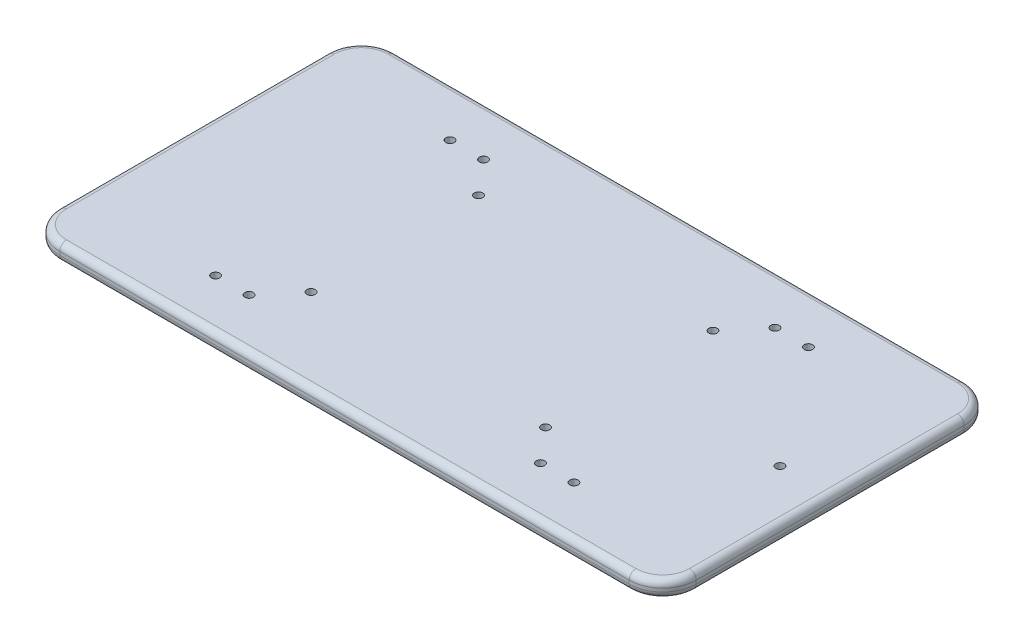
ISO-10303-21;
HEADER;
FILE_DESCRIPTION(('STEP AP214'),'2;1');
FILE_NAME('part.step','',(''),(''),'','','');
FILE_SCHEMA(('AUTOMOTIVE_DESIGN { 1 0 10303 214 1 1 1 1 }'));
ENDSEC;
DATA;
#1=APPLICATION_CONTEXT('core data for automotive mechanical design processes');
#2=APPLICATION_PROTOCOL_DEFINITION('international standard','automotive_design',2000,#1);
#3=PRODUCT_CONTEXT('',#1,'mechanical');
#4=PRODUCT('Part','Part','',(#3));
#5=PRODUCT_RELATED_PRODUCT_CATEGORY('part','',(#4));
#6=PRODUCT_DEFINITION_FORMATION('','',#4);
#7=PRODUCT_DEFINITION_CONTEXT('part definition',#1,'design');
#8=PRODUCT_DEFINITION('design','',#6,#7);
#9=PRODUCT_DEFINITION_SHAPE('','',#8);
#10=(LENGTH_UNIT() NAMED_UNIT(*) SI_UNIT(.MILLI.,.METRE.));
#11=(NAMED_UNIT(*) PLANE_ANGLE_UNIT() SI_UNIT($,.RADIAN.));
#12=(NAMED_UNIT(*) SI_UNIT($,.STERADIAN.) SOLID_ANGLE_UNIT());
#13=UNCERTAINTY_MEASURE_WITH_UNIT(LENGTH_MEASURE(1.E-05),#10,'distance_accuracy_value','');
#14=(GEOMETRIC_REPRESENTATION_CONTEXT(3) GLOBAL_UNCERTAINTY_ASSIGNED_CONTEXT((#13)) GLOBAL_UNIT_ASSIGNED_CONTEXT((#10,
#11,#12)) REPRESENTATION_CONTEXT('',''));
#15=CARTESIAN_POINT('',(0.,0.,0.));
#16=DIRECTION('',(0.,0.,1.));
#17=DIRECTION('',(1.,0.,0.));
#18=AXIS2_PLACEMENT_3D('',#15,#16,#17);
#19=CARTESIAN_POINT('',(0.35780175355887,47.5,0.));
#20=DIRECTION('',(0.,-1.,0.));
#21=DIRECTION('',(0.,0.,-1.));
#22=AXIS2_PLACEMENT_3D('',#19,#20,#21);
#23=PLANE('',#22);
#24=DIRECTION('',(0.,0.,1.));
#25=VECTOR('',#24,1.);
#26=CARTESIAN_POINT('',(-1673.64219824644,47.5,0.));
#27=LINE('',#26,#25);
#28=CARTESIAN_POINT('',(-1673.64219824644,47.5,-720.));
#29=VERTEX_POINT('',#28);
#30=CARTESIAN_POINT('',(-1673.64219824644,47.5,720.));
#31=VERTEX_POINT('',#30);
#32=EDGE_CURVE('E60',#29,#31,#27,.T.);
#33=ORIENTED_EDGE('',*,*,#32,.T.);
#34=CARTESIAN_POINT('',(-1529.64219824644,47.5,720.));
#35=DIRECTION('',(0.,-1.,0.));
#36=DIRECTION('',(0.,0.,-1.));
#37=AXIS2_PLACEMENT_3D('',#34,#35,#36);
#38=CIRCLE('',#37,144.);
#39=CARTESIAN_POINT('',(-1529.64219824644,47.5,864.));
#40=VERTEX_POINT('',#39);
#41=EDGE_CURVE('E273',#31,#40,#38,.F.);
#42=ORIENTED_EDGE('',*,*,#41,.T.);
#43=DIRECTION('',(1.,0.,0.));
#44=VECTOR('',#43,1.);
#45=CARTESIAN_POINT('',(0.35780175355887,47.5,864.));
#46=LINE('',#45,#44);
#47=CARTESIAN_POINT('',(1530.35780175356,47.5,864.));
#48=VERTEX_POINT('',#47);
#49=EDGE_CURVE('E254',#40,#48,#46,.T.);
#50=ORIENTED_EDGE('',*,*,#49,.T.);
#51=CARTESIAN_POINT('',(1530.35780175356,47.5,720.));
#52=DIRECTION('',(0.,-1.,0.));
#53=DIRECTION('',(0.,0.,-1.));
#54=AXIS2_PLACEMENT_3D('',#51,#52,#53);
#55=CIRCLE('',#54,144.);
#56=CARTESIAN_POINT('',(1674.35780175356,47.5,720.));
#57=VERTEX_POINT('',#56);
#58=EDGE_CURVE('E257',#48,#57,#55,.F.);
#59=ORIENTED_EDGE('',*,*,#58,.T.);
#60=DIRECTION('',(0.,0.,-1.));
#61=VECTOR('',#60,1.);
#62=CARTESIAN_POINT('',(1674.35780175356,47.5,0.));
#63=LINE('',#62,#61);
#64=CARTESIAN_POINT('',(1674.35780175356,47.5,-720.));
#65=VERTEX_POINT('',#64);
#66=EDGE_CURVE('E260',#57,#65,#63,.T.);
#67=ORIENTED_EDGE('',*,*,#66,.T.);
#68=CARTESIAN_POINT('',(1530.35780175356,47.5,-720.));
#69=DIRECTION('',(0.,-1.,0.));
#70=DIRECTION('',(0.,0.,-1.));
#71=AXIS2_PLACEMENT_3D('',#68,#69,#70);
#72=CIRCLE('',#71,144.);
#73=CARTESIAN_POINT('',(1530.35780175356,47.5,-864.));
#74=VERTEX_POINT('',#73);
#75=EDGE_CURVE('E263',#65,#74,#72,.F.);
#76=ORIENTED_EDGE('',*,*,#75,.T.);
#77=DIRECTION('',(-1.,0.,0.));
#78=VECTOR('',#77,1.);
#79=CARTESIAN_POINT('',(0.35780175355887,47.5,-864.));
#80=LINE('',#79,#78);
#81=CARTESIAN_POINT('',(-1529.64219824644,47.5,-864.));
#82=VERTEX_POINT('',#81);
#83=EDGE_CURVE('E266',#74,#82,#80,.T.);
#84=ORIENTED_EDGE('',*,*,#83,.T.);
#85=CARTESIAN_POINT('',(-1529.64219824644,47.5,-720.));
#86=DIRECTION('',(0.,-1.,0.));
#87=DIRECTION('',(0.,0.,-1.));
#88=AXIS2_PLACEMENT_3D('',#85,#86,#87);
#89=CIRCLE('',#88,144.);
#90=EDGE_CURVE('E65',#82,#29,#89,.F.);
#91=ORIENTED_EDGE('',*,*,#90,.T.);
#92=EDGE_LOOP('',(#33,#42,#50,#59,#67,#76,#84,#91));
#93=FACE_BOUND('',#92,.T.);
#94=CARTESIAN_POINT('',(-629.642198246441,47.5,-450.));
#95=DIRECTION('',(0.,1.,0.));
#96=DIRECTION('',(0.,0.,1.));
#97=AXIS2_PLACEMENT_3D('',#94,#95,#96);
#98=CIRCLE('',#97,22.5);
#99=CARTESIAN_POINT('',(-629.642198246441,47.5,-427.5));
#100=VERTEX_POINT('',#99);
#101=EDGE_CURVE('E356',#100,#100,#98,.T.);
#102=ORIENTED_EDGE('',*,*,#101,.F.);
#103=EDGE_LOOP('',(#102));
#104=FACE_BOUND('',#103,.T.);
#105=CARTESIAN_POINT('',(630.357801753559,47.5,-450.));
#106=DIRECTION('',(0.,1.,0.));
#107=DIRECTION('',(0.,0.,1.));
#108=AXIS2_PLACEMENT_3D('',#105,#106,#107);
#109=CIRCLE('',#108,22.5);
#110=CARTESIAN_POINT('',(630.357801753559,47.5,-427.5));
#111=VERTEX_POINT('',#110);
#112=EDGE_CURVE('E855',#111,#111,#109,.T.);
#113=ORIENTED_EDGE('',*,*,#112,.F.);
#114=EDGE_LOOP('',(#113));
#115=FACE_BOUND('',#114,.T.);
#116=CARTESIAN_POINT('',(630.357801753559,47.5,450.));
#117=DIRECTION('',(0.,1.,0.));
#118=DIRECTION('',(0.,0.,1.));
#119=AXIS2_PLACEMENT_3D('',#116,#117,#118);
#120=CIRCLE('',#119,22.5);
#121=CARTESIAN_POINT('',(630.357801753559,47.5,472.5));
#122=VERTEX_POINT('',#121);
#123=EDGE_CURVE('E863',#122,#122,#120,.T.);
#124=ORIENTED_EDGE('',*,*,#123,.F.);
#125=EDGE_LOOP('',(#124));
#126=FACE_BOUND('',#125,.T.);
#127=CARTESIAN_POINT('',(-629.642198246441,47.5,450.));
#128=DIRECTION('',(0.,1.,0.));
#129=DIRECTION('',(0.,0.,1.));
#130=AXIS2_PLACEMENT_3D('',#127,#128,#129);
#131=CIRCLE('',#130,22.5);
#132=CARTESIAN_POINT('',(-629.642198246441,47.5,472.5));
#133=VERTEX_POINT('',#132);
#134=EDGE_CURVE('E870',#133,#133,#131,.T.);
#135=ORIENTED_EDGE('',*,*,#134,.F.);
#136=EDGE_LOOP('',(#135));
#137=FACE_BOUND('',#136,.T.);
#138=CARTESIAN_POINT('',(1440.35780175356,47.5,1.22488336844059E-13));
#139=DIRECTION('',(0.,1.,0.));
#140=DIRECTION('',(0.,0.,1.));
#141=AXIS2_PLACEMENT_3D('',#138,#139,#140);
#142=CIRCLE('',#141,22.5);
#143=CARTESIAN_POINT('',(1440.35780175356,47.5,22.5000000000001));
#144=VERTEX_POINT('',#143);
#145=EDGE_CURVE('E878',#144,#144,#142,.T.);
#146=ORIENTED_EDGE('',*,*,#145,.F.);
#147=EDGE_LOOP('',(#146));
#148=FACE_BOUND('',#147,.T.);
#149=CARTESIAN_POINT('',(-962.642198246441,47.5,630.));
#150=DIRECTION('',(0.,1.,0.));
#151=DIRECTION('',(0.,0.,1.));
#152=AXIS2_PLACEMENT_3D('',#149,#150,#151);
#153=CIRCLE('',#152,22.5);
#154=CARTESIAN_POINT('',(-962.642198246441,47.5,652.5));
#155=VERTEX_POINT('',#154);
#156=EDGE_CURVE('E886',#155,#155,#153,.T.);
#157=ORIENTED_EDGE('',*,*,#156,.F.);
#158=EDGE_LOOP('',(#157));
#159=FACE_BOUND('',#158,.T.);
#160=CARTESIAN_POINT('',(-782.642198246441,47.5,630.));
#161=DIRECTION('',(0.,1.,0.));
#162=DIRECTION('',(0.,0.,1.));
#163=AXIS2_PLACEMENT_3D('',#160,#161,#162);
#164=CIRCLE('',#163,22.5000000000001);
#165=CARTESIAN_POINT('',(-782.642198246441,47.5,652.5));
#166=VERTEX_POINT('',#165);
#167=EDGE_CURVE('E894',#166,#166,#164,.T.);
#168=ORIENTED_EDGE('',*,*,#167,.F.);
#169=EDGE_LOOP('',(#168));
#170=FACE_BOUND('',#169,.T.);
#171=CARTESIAN_POINT('',(-782.642198246441,47.5,-630.));
#172=DIRECTION('',(0.,1.,0.));
#173=DIRECTION('',(0.,0.,-1.));
#174=AXIS2_PLACEMENT_3D('',#171,#172,#173);
#175=CIRCLE('',#174,22.5000000000001);
#176=CARTESIAN_POINT('',(-782.642198246441,47.5,-652.5));
#177=VERTEX_POINT('',#176);
#178=EDGE_CURVE('E902',#177,#177,#175,.T.);
#179=ORIENTED_EDGE('',*,*,#178,.F.);
#180=EDGE_LOOP('',(#179));
#181=FACE_BOUND('',#180,.T.);
#182=CARTESIAN_POINT('',(-962.642198246441,47.5,-630.));
#183=DIRECTION('',(0.,1.,0.));
#184=DIRECTION('',(0.,0.,-1.));
#185=AXIS2_PLACEMENT_3D('',#182,#183,#184);
#186=CIRCLE('',#185,22.5);
#187=CARTESIAN_POINT('',(-962.642198246441,47.5,-652.5));
#188=VERTEX_POINT('',#187);
#189=EDGE_CURVE('E910',#188,#188,#186,.T.);
#190=ORIENTED_EDGE('',*,*,#189,.F.);
#191=EDGE_LOOP('',(#190));
#192=FACE_BOUND('',#191,.T.);
#193=CARTESIAN_POINT('',(783.357801753558,47.5,-630.));
#194=DIRECTION('',(0.,1.,0.));
#195=DIRECTION('',(0.,0.,1.));
#196=AXIS2_PLACEMENT_3D('',#193,#194,#195);
#197=CIRCLE('',#196,22.5000000000001);
#198=CARTESIAN_POINT('',(783.357801753558,47.5,-607.5));
#199=VERTEX_POINT('',#198);
#200=EDGE_CURVE('E918',#199,#199,#197,.T.);
#201=ORIENTED_EDGE('',*,*,#200,.F.);
#202=EDGE_LOOP('',(#201));
#203=FACE_BOUND('',#202,.T.);
#204=CARTESIAN_POINT('',(963.357801753558,47.5,-630.));
#205=DIRECTION('',(0.,1.,0.));
#206=DIRECTION('',(0.,0.,1.));
#207=AXIS2_PLACEMENT_3D('',#204,#205,#206);
#208=CIRCLE('',#207,22.5);
#209=CARTESIAN_POINT('',(963.357801753558,47.5,-607.5));
#210=VERTEX_POINT('',#209);
#211=EDGE_CURVE('E926',#210,#210,#208,.T.);
#212=ORIENTED_EDGE('',*,*,#211,.F.);
#213=EDGE_LOOP('',(#212));
#214=FACE_BOUND('',#213,.T.);
#215=CARTESIAN_POINT('',(963.357801753558,47.5,630.));
#216=DIRECTION('',(0.,1.,0.));
#217=DIRECTION('',(0.,0.,-1.));
#218=AXIS2_PLACEMENT_3D('',#215,#216,#217);
#219=CIRCLE('',#218,22.5);
#220=CARTESIAN_POINT('',(963.357801753558,47.5,607.5));
#221=VERTEX_POINT('',#220);
#222=EDGE_CURVE('E934',#221,#221,#219,.T.);
#223=ORIENTED_EDGE('',*,*,#222,.F.);
#224=EDGE_LOOP('',(#223));
#225=FACE_BOUND('',#224,.T.);
#226=CARTESIAN_POINT('',(783.357801753558,47.5,630.));
#227=DIRECTION('',(0.,1.,0.));
#228=DIRECTION('',(0.,0.,-1.));
#229=AXIS2_PLACEMENT_3D('',#226,#227,#228);
#230=CIRCLE('',#229,22.5000000000001);
#231=CARTESIAN_POINT('',(783.357801753558,47.5,607.5));
#232=VERTEX_POINT('',#231);
#233=EDGE_CURVE('E942',#232,#232,#230,.T.);
#234=ORIENTED_EDGE('',*,*,#233,.F.);
#235=EDGE_LOOP('',(#234));
#236=FACE_BOUND('',#235,.T.);
#237=ADVANCED_FACE('F42',(#93,#104,#115,#126,#137,#148,#159,#170,#181,#192,#203,#214,#225,#236),
#23,.F.);
#238=CARTESIAN_POINT('',(0.35780175355887,-42.5,0.));
#239=DIRECTION('',(0.,-1.,0.));
#240=DIRECTION('',(0.,0.,-1.));
#241=AXIS2_PLACEMENT_3D('',#238,#239,#240);
#242=PLANE('',#241);
#243=DIRECTION('',(1.,0.,0.));
#244=VECTOR('',#243,1.);
#245=CARTESIAN_POINT('',(-1529.64219824644,-42.5,864.));
#246=LINE('',#245,#244);
#247=CARTESIAN_POINT('',(1530.35780175356,-42.5,864.));
#248=VERTEX_POINT('',#247);
#249=CARTESIAN_POINT('',(-1529.64219824644,-42.5,864.));
#250=VERTEX_POINT('',#249);
#251=EDGE_CURVE('E162',#248,#250,#246,.F.);
#252=ORIENTED_EDGE('',*,*,#251,.T.);
#253=CARTESIAN_POINT('',(-1529.64219824644,-42.5,720.));
#254=DIRECTION('',(0.,-1.,0.));
#255=DIRECTION('',(0.,0.,-1.));
#256=AXIS2_PLACEMENT_3D('',#253,#254,#255);
#257=CIRCLE('',#256,144.);
#258=CARTESIAN_POINT('',(-1673.64219824644,-42.5,720.));
#259=VERTEX_POINT('',#258);
#260=EDGE_CURVE('E208',#250,#259,#257,.T.);
#261=ORIENTED_EDGE('',*,*,#260,.T.);
#262=DIRECTION('',(0.,0.,1.));
#263=VECTOR('',#262,1.);
#264=CARTESIAN_POINT('',(-1673.64219824644,-42.5,-720.));
#265=LINE('',#264,#263);
#266=CARTESIAN_POINT('',(-1673.64219824644,-42.5,-720.));
#267=VERTEX_POINT('',#266);
#268=EDGE_CURVE('E205',#259,#267,#265,.F.);
#269=ORIENTED_EDGE('',*,*,#268,.T.);
#270=CARTESIAN_POINT('',(-1529.64219824644,-42.5,-720.));
#271=DIRECTION('',(0.,-1.,0.));
#272=DIRECTION('',(0.,0.,-1.));
#273=AXIS2_PLACEMENT_3D('',#270,#271,#272);
#274=CIRCLE('',#273,144.);
#275=CARTESIAN_POINT('',(-1529.64219824644,-42.5,-864.));
#276=VERTEX_POINT('',#275);
#277=EDGE_CURVE('E202',#267,#276,#274,.T.);
#278=ORIENTED_EDGE('',*,*,#277,.T.);
#279=DIRECTION('',(-1.,0.,0.));
#280=VECTOR('',#279,1.);
#281=CARTESIAN_POINT('',(1530.35780175356,-42.5,-864.));
#282=LINE('',#281,#280);
#283=CARTESIAN_POINT('',(1530.35780175356,-42.5,-864.));
#284=VERTEX_POINT('',#283);
#285=EDGE_CURVE('E199',#276,#284,#282,.F.);
#286=ORIENTED_EDGE('',*,*,#285,.T.);
#287=CARTESIAN_POINT('',(1530.35780175356,-42.5,-720.));
#288=DIRECTION('',(0.,-1.,0.));
#289=DIRECTION('',(0.,0.,-1.));
#290=AXIS2_PLACEMENT_3D('',#287,#288,#289);
#291=CIRCLE('',#290,144.);
#292=CARTESIAN_POINT('',(1674.35780175356,-42.5,-720.));
#293=VERTEX_POINT('',#292);
#294=EDGE_CURVE('E196',#284,#293,#291,.T.);
#295=ORIENTED_EDGE('',*,*,#294,.T.);
#296=DIRECTION('',(0.,0.,-1.));
#297=VECTOR('',#296,1.);
#298=CARTESIAN_POINT('',(1674.35780175356,-42.5,720.));
#299=LINE('',#298,#297);
#300=CARTESIAN_POINT('',(1674.35780175356,-42.5,720.));
#301=VERTEX_POINT('',#300);
#302=EDGE_CURVE('E165',#293,#301,#299,.F.);
#303=ORIENTED_EDGE('',*,*,#302,.T.);
#304=CARTESIAN_POINT('',(1530.35780175356,-42.5,720.));
#305=DIRECTION('',(0.,-1.,0.));
#306=DIRECTION('',(0.,0.,-1.));
#307=AXIS2_PLACEMENT_3D('',#304,#305,#306);
#308=CIRCLE('',#307,144.);
#309=EDGE_CURVE('E156',#301,#248,#308,.T.);
#310=ORIENTED_EDGE('',*,*,#309,.T.);
#311=EDGE_LOOP('',(#252,#261,#269,#278,#286,#295,#303,#310));
#312=FACE_BOUND('',#311,.T.);
#313=CARTESIAN_POINT('',(963.357801753558,-42.5,630.));
#314=DIRECTION('',(0.,1.,0.));
#315=DIRECTION('',(0.,0.,-1.));
#316=AXIS2_PLACEMENT_3D('',#313,#314,#315);
#317=CIRCLE('',#316,22.5);
#318=CARTESIAN_POINT('',(963.357801753558,-42.5,607.5));
#319=VERTEX_POINT('',#318);
#320=EDGE_CURVE('E938',#319,#319,#317,.T.);
#321=ORIENTED_EDGE('',*,*,#320,.T.);
#322=EDGE_LOOP('',(#321));
#323=FACE_BOUND('',#322,.T.);
#324=CARTESIAN_POINT('',(783.357801753558,-42.5,-630.));
#325=DIRECTION('',(0.,1.,0.));
#326=DIRECTION('',(0.,0.,1.));
#327=AXIS2_PLACEMENT_3D('',#324,#325,#326);
#328=CIRCLE('',#327,22.5000000000001);
#329=CARTESIAN_POINT('',(783.357801753558,-42.5,-607.5));
#330=VERTEX_POINT('',#329);
#331=EDGE_CURVE('E922',#330,#330,#328,.T.);
#332=ORIENTED_EDGE('',*,*,#331,.T.);
#333=EDGE_LOOP('',(#332));
#334=FACE_BOUND('',#333,.T.);
#335=CARTESIAN_POINT('',(-782.642198246441,-42.5,-630.));
#336=DIRECTION('',(0.,1.,0.));
#337=DIRECTION('',(0.,0.,-1.));
#338=AXIS2_PLACEMENT_3D('',#335,#336,#337);
#339=CIRCLE('',#338,22.5000000000001);
#340=CARTESIAN_POINT('',(-782.642198246441,-42.5,-652.5));
#341=VERTEX_POINT('',#340);
#342=EDGE_CURVE('E906',#341,#341,#339,.T.);
#343=ORIENTED_EDGE('',*,*,#342,.T.);
#344=EDGE_LOOP('',(#343));
#345=FACE_BOUND('',#344,.T.);
#346=CARTESIAN_POINT('',(-962.642198246441,-42.5,630.));
#347=DIRECTION('',(0.,1.,0.));
#348=DIRECTION('',(0.,0.,1.));
#349=AXIS2_PLACEMENT_3D('',#346,#347,#348);
#350=CIRCLE('',#349,22.5);
#351=CARTESIAN_POINT('',(-962.642198246441,-42.5,652.5));
#352=VERTEX_POINT('',#351);
#353=EDGE_CURVE('E890',#352,#352,#350,.T.);
#354=ORIENTED_EDGE('',*,*,#353,.T.);
#355=EDGE_LOOP('',(#354));
#356=FACE_BOUND('',#355,.T.);
#357=CARTESIAN_POINT('',(-629.642198246441,-42.5,450.));
#358=DIRECTION('',(0.,1.,0.));
#359=DIRECTION('',(0.,0.,1.));
#360=AXIS2_PLACEMENT_3D('',#357,#358,#359);
#361=CIRCLE('',#360,22.5);
#362=CARTESIAN_POINT('',(-629.642198246441,-42.5,472.5));
#363=VERTEX_POINT('',#362);
#364=EDGE_CURVE('E874',#363,#363,#361,.T.);
#365=ORIENTED_EDGE('',*,*,#364,.T.);
#366=EDGE_LOOP('',(#365));
#367=FACE_BOUND('',#366,.T.);
#368=CARTESIAN_POINT('',(630.357801753559,-42.5,-450.));
#369=DIRECTION('',(0.,1.,0.));
#370=DIRECTION('',(0.,0.,1.));
#371=AXIS2_PLACEMENT_3D('',#368,#369,#370);
#372=CIRCLE('',#371,22.5);
#373=CARTESIAN_POINT('',(630.357801753559,-42.5,-427.5));
#374=VERTEX_POINT('',#373);
#375=EDGE_CURVE('E858',#374,#374,#372,.T.);
#376=ORIENTED_EDGE('',*,*,#375,.T.);
#377=EDGE_LOOP('',(#376));
#378=FACE_BOUND('',#377,.T.);
#379=CARTESIAN_POINT('',(-629.642198246441,-42.5,-450.));
#380=DIRECTION('',(0.,1.,0.));
#381=DIRECTION('',(0.,0.,1.));
#382=AXIS2_PLACEMENT_3D('',#379,#380,#381);
#383=CIRCLE('',#382,22.5);
#384=CARTESIAN_POINT('',(-629.642198246441,-42.5,-427.5));
#385=VERTEX_POINT('',#384);
#386=EDGE_CURVE('E363',#385,#385,#383,.T.);
#387=ORIENTED_EDGE('',*,*,#386,.T.);
#388=EDGE_LOOP('',(#387));
#389=FACE_BOUND('',#388,.T.);
#390=CARTESIAN_POINT('',(630.357801753559,-42.5,450.));
#391=DIRECTION('',(0.,1.,0.));
#392=DIRECTION('',(0.,0.,1.));
#393=AXIS2_PLACEMENT_3D('',#390,#391,#392);
#394=CIRCLE('',#393,22.5);
#395=CARTESIAN_POINT('',(630.357801753559,-42.5,472.5));
#396=VERTEX_POINT('',#395);
#397=EDGE_CURVE('E866',#396,#396,#394,.T.);
#398=ORIENTED_EDGE('',*,*,#397,.T.);
#399=EDGE_LOOP('',(#398));
#400=FACE_BOUND('',#399,.T.);
#401=CARTESIAN_POINT('',(1440.35780175356,-42.5,1.22488336844059E-13));
#402=DIRECTION('',(0.,1.,0.));
#403=DIRECTION('',(0.,0.,1.));
#404=AXIS2_PLACEMENT_3D('',#401,#402,#403);
#405=CIRCLE('',#404,22.5);
#406=CARTESIAN_POINT('',(1440.35780175356,-42.5,22.5000000000001));
#407=VERTEX_POINT('',#406);
#408=EDGE_CURVE('E882',#407,#407,#405,.T.);
#409=ORIENTED_EDGE('',*,*,#408,.T.);
#410=EDGE_LOOP('',(#409));
#411=FACE_BOUND('',#410,.T.);
#412=CARTESIAN_POINT('',(-782.642198246441,-42.5,630.));
#413=DIRECTION('',(0.,1.,0.));
#414=DIRECTION('',(0.,0.,1.));
#415=AXIS2_PLACEMENT_3D('',#412,#413,#414);
#416=CIRCLE('',#415,22.5000000000001);
#417=CARTESIAN_POINT('',(-782.642198246441,-42.5,652.5));
#418=VERTEX_POINT('',#417);
#419=EDGE_CURVE('E898',#418,#418,#416,.T.);
#420=ORIENTED_EDGE('',*,*,#419,.T.);
#421=EDGE_LOOP('',(#420));
#422=FACE_BOUND('',#421,.T.);
#423=CARTESIAN_POINT('',(-962.642198246441,-42.5,-630.));
#424=DIRECTION('',(0.,1.,0.));
#425=DIRECTION('',(0.,0.,-1.));
#426=AXIS2_PLACEMENT_3D('',#423,#424,#425);
#427=CIRCLE('',#426,22.5);
#428=CARTESIAN_POINT('',(-962.642198246441,-42.5,-652.5));
#429=VERTEX_POINT('',#428);
#430=EDGE_CURVE('E914',#429,#429,#427,.T.);
#431=ORIENTED_EDGE('',*,*,#430,.T.);
#432=EDGE_LOOP('',(#431));
#433=FACE_BOUND('',#432,.T.);
#434=CARTESIAN_POINT('',(963.357801753558,-42.5,-630.));
#435=DIRECTION('',(0.,1.,0.));
#436=DIRECTION('',(0.,0.,1.));
#437=AXIS2_PLACEMENT_3D('',#434,#435,#436);
#438=CIRCLE('',#437,22.5);
#439=CARTESIAN_POINT('',(963.357801753558,-42.5,-607.5));
#440=VERTEX_POINT('',#439);
#441=EDGE_CURVE('E930',#440,#440,#438,.T.);
#442=ORIENTED_EDGE('',*,*,#441,.T.);
#443=EDGE_LOOP('',(#442));
#444=FACE_BOUND('',#443,.T.);
#445=CARTESIAN_POINT('',(783.357801753558,-42.5,630.));
#446=DIRECTION('',(0.,1.,0.));
#447=DIRECTION('',(0.,0.,-1.));
#448=AXIS2_PLACEMENT_3D('',#445,#446,#447);
#449=CIRCLE('',#448,22.5000000000001);
#450=CARTESIAN_POINT('',(783.357801753558,-42.5,607.5));
#451=VERTEX_POINT('',#450);
#452=EDGE_CURVE('E300',#451,#451,#449,.T.);
#453=ORIENTED_EDGE('',*,*,#452,.T.);
#454=EDGE_LOOP('',(#453));
#455=FACE_BOUND('',#454,.T.);
#456=ADVANCED_FACE('F158',(#312,#323,#334,#345,#356,#367,#378,#389,#400,#411,#422,#433,#444,
#455),#242,.T.);
#457=CARTESIAN_POINT('',(1710.35780175356,47.5,900.));
#458=DIRECTION('',(-1.,0.,0.));
#459=DIRECTION('',(0.,0.,1.));
#460=AXIS2_PLACEMENT_3D('',#457,#458,#459);
#461=PLANE('',#460);
#462=DIRECTION('',(0.,-1.,0.));
#463=VECTOR('',#462,1.);
#464=CARTESIAN_POINT('',(1710.35780175356,47.5,720.));
#465=LINE('',#464,#463);
#466=CARTESIAN_POINT('',(1710.35780175356,11.5,720.));
#467=VERTEX_POINT('',#466);
#468=CARTESIAN_POINT('',(1710.35780175356,-6.5,720.));
#469=VERTEX_POINT('',#468);
#470=EDGE_CURVE('E355',#467,#469,#465,.T.);
#471=ORIENTED_EDGE('',*,*,#470,.T.);
#472=DIRECTION('',(0.,0.,-1.));
#473=VECTOR('',#472,1.);
#474=CARTESIAN_POINT('',(1710.35780175356,-6.5,-720.));
#475=LINE('',#474,#473);
#476=CARTESIAN_POINT('',(1710.35780175356,-6.5,-720.));
#477=VERTEX_POINT('',#476);
#478=EDGE_CURVE('E246',#469,#477,#475,.T.);
#479=ORIENTED_EDGE('',*,*,#478,.T.);
#480=DIRECTION('',(0.,-1.,0.));
#481=VECTOR('',#480,1.);
#482=CARTESIAN_POINT('',(1710.35780175356,47.5,-720.));
#483=LINE('',#482,#481);
#484=CARTESIAN_POINT('',(1710.35780175356,11.5,-720.));
#485=VERTEX_POINT('',#484);
#486=EDGE_CURVE('E345',#477,#485,#483,.F.);
#487=ORIENTED_EDGE('',*,*,#486,.T.);
#488=DIRECTION('',(0.,0.,-1.));
#489=VECTOR('',#488,1.);
#490=CARTESIAN_POINT('',(1710.35780175356,11.5,900.));
#491=LINE('',#490,#489);
#492=EDGE_CURVE('E243',#485,#467,#491,.F.);
#493=ORIENTED_EDGE('',*,*,#492,.T.);
#494=EDGE_LOOP('',(#471,#479,#487,#493));
#495=FACE_BOUND('',#494,.T.);
#496=ADVANCED_FACE('F351',(#495),#461,.F.);
#497=CARTESIAN_POINT('',(-1709.64219824644,47.5,-900.));
#498=DIRECTION('',(0.,0.,1.));
#499=DIRECTION('',(1.,0.,0.));
#500=AXIS2_PLACEMENT_3D('',#497,#498,#499);
#501=PLANE('',#500);
#502=DIRECTION('',(0.,-1.,0.));
#503=VECTOR('',#502,1.);
#504=CARTESIAN_POINT('',(1530.35780175356,47.5,-900.));
#505=LINE('',#504,#503);
#506=CARTESIAN_POINT('',(1530.35780175356,11.5,-900.));
#507=VERTEX_POINT('',#506);
#508=CARTESIAN_POINT('',(1530.35780175356,-6.5,-900.));
#509=VERTEX_POINT('',#508);
#510=EDGE_CURVE('E348',#507,#509,#505,.T.);
#511=ORIENTED_EDGE('',*,*,#510,.T.);
#512=DIRECTION('',(-1.,0.,0.));
#513=VECTOR('',#512,1.);
#514=CARTESIAN_POINT('',(-1529.64219824644,-6.5,-900.));
#515=LINE('',#514,#513);
#516=CARTESIAN_POINT('',(-1529.64219824644,-6.5,-900.));
#517=VERTEX_POINT('',#516);
#518=EDGE_CURVE('E234',#509,#517,#515,.T.);
#519=ORIENTED_EDGE('',*,*,#518,.T.);
#520=DIRECTION('',(0.,-1.,0.));
#521=VECTOR('',#520,1.);
#522=CARTESIAN_POINT('',(-1529.64219824644,47.5,-900.));
#523=LINE('',#522,#521);
#524=CARTESIAN_POINT('',(-1529.64219824644,11.5,-900.));
#525=VERTEX_POINT('',#524);
#526=EDGE_CURVE('E374',#517,#525,#523,.F.);
#527=ORIENTED_EDGE('',*,*,#526,.T.);
#528=DIRECTION('',(-1.,0.,0.));
#529=VECTOR('',#528,1.);
#530=CARTESIAN_POINT('',(-1709.64219824644,11.5,-900.));
#531=LINE('',#530,#529);
#532=EDGE_CURVE('E231',#525,#507,#531,.F.);
#533=ORIENTED_EDGE('',*,*,#532,.T.);
#534=EDGE_LOOP('',(#511,#519,#527,#533));
#535=FACE_BOUND('',#534,.T.);
#536=ADVANCED_FACE('F440',(#535),#501,.F.);
#537=CARTESIAN_POINT('',(-1709.64219824644,47.5,900.));
#538=DIRECTION('',(1.,0.,0.));
#539=DIRECTION('',(0.,0.,-1.));
#540=AXIS2_PLACEMENT_3D('',#537,#538,#539);
#541=PLANE('',#540);
#542=DIRECTION('',(0.,-1.,0.));
#543=VECTOR('',#542,1.);
#544=CARTESIAN_POINT('',(-1709.64219824644,47.5,-720.));
#545=LINE('',#544,#543);
#546=CARTESIAN_POINT('',(-1709.64219824644,11.5,-720.));
#547=VERTEX_POINT('',#546);
#548=CARTESIAN_POINT('',(-1709.64219824644,-6.5,-720.));
#549=VERTEX_POINT('',#548);
#550=EDGE_CURVE('E186',#547,#549,#545,.T.);
#551=ORIENTED_EDGE('',*,*,#550,.T.);
#552=DIRECTION('',(0.,0.,1.));
#553=VECTOR('',#552,1.);
#554=CARTESIAN_POINT('',(-1709.64219824644,-6.5,720.));
#555=LINE('',#554,#553);
#556=CARTESIAN_POINT('',(-1709.64219824644,-6.5,720.));
#557=VERTEX_POINT('',#556);
#558=EDGE_CURVE('E222',#549,#557,#555,.T.);
#559=ORIENTED_EDGE('',*,*,#558,.T.);
#560=DIRECTION('',(0.,-1.,0.));
#561=VECTOR('',#560,1.);
#562=CARTESIAN_POINT('',(-1709.64219824644,47.5,720.));
#563=LINE('',#562,#561);
#564=CARTESIAN_POINT('',(-1709.64219824644,11.5,720.));
#565=VERTEX_POINT('',#564);
#566=EDGE_CURVE('E190',#557,#565,#563,.F.);
#567=ORIENTED_EDGE('',*,*,#566,.T.);
#568=DIRECTION('',(0.,0.,1.));
#569=VECTOR('',#568,1.);
#570=CARTESIAN_POINT('',(-1709.64219824644,11.5,900.));
#571=LINE('',#570,#569);
#572=EDGE_CURVE('E219',#565,#547,#571,.F.);
#573=ORIENTED_EDGE('',*,*,#572,.T.);
#574=EDGE_LOOP('',(#551,#559,#567,#573));
#575=FACE_BOUND('',#574,.T.);
#576=ADVANCED_FACE('F383',(#575),#541,.F.);
#577=CARTESIAN_POINT('',(-1709.64219824644,47.5,900.));
#578=DIRECTION('',(0.,0.,-1.));
#579=DIRECTION('',(-1.,0.,0.));
#580=AXIS2_PLACEMENT_3D('',#577,#578,#579);
#581=PLANE('',#580);
#582=DIRECTION('',(0.,-1.,0.));
#583=VECTOR('',#582,1.);
#584=CARTESIAN_POINT('',(-1529.64219824644,47.5,900.));
#585=LINE('',#584,#583);
#586=CARTESIAN_POINT('',(-1529.64219824644,11.5,900.));
#587=VERTEX_POINT('',#586);
#588=CARTESIAN_POINT('',(-1529.64219824644,-6.5,900.));
#589=VERTEX_POINT('',#588);
#590=EDGE_CURVE('E360',#587,#589,#585,.T.);
#591=ORIENTED_EDGE('',*,*,#590,.T.);
#592=DIRECTION('',(1.,0.,0.));
#593=VECTOR('',#592,1.);
#594=CARTESIAN_POINT('',(1530.35780175356,-6.5,900.));
#595=LINE('',#594,#593);
#596=CARTESIAN_POINT('',(1530.35780175356,-6.5,900.));
#597=VERTEX_POINT('',#596);
#598=EDGE_CURVE('E11',#589,#597,#595,.T.);
#599=ORIENTED_EDGE('',*,*,#598,.T.);
#600=DIRECTION('',(0.,-1.,0.));
#601=VECTOR('',#600,1.);
#602=CARTESIAN_POINT('',(1530.35780175356,47.5,900.));
#603=LINE('',#602,#601);
#604=CARTESIAN_POINT('',(1530.35780175356,11.5,900.));
#605=VERTEX_POINT('',#604);
#606=EDGE_CURVE('E370',#597,#605,#603,.F.);
#607=ORIENTED_EDGE('',*,*,#606,.T.);
#608=DIRECTION('',(1.,0.,0.));
#609=VECTOR('',#608,1.);
#610=CARTESIAN_POINT('',(-1709.64219824644,11.5,900.));
#611=LINE('',#610,#609);
#612=EDGE_CURVE('E52',#605,#587,#611,.F.);
#613=ORIENTED_EDGE('',*,*,#612,.T.);
#614=EDGE_LOOP('',(#591,#599,#607,#613));
#615=FACE_BOUND('',#614,.T.);
#616=ADVANCED_FACE('F434',(#615),#581,.F.);
#617=CARTESIAN_POINT('',(-629.642198246441,47.5,-450.));
#618=DIRECTION('',(0.,-1.,0.));
#619=DIRECTION('',(0.,0.,-1.));
#620=AXIS2_PLACEMENT_3D('',#617,#618,#619);
#621=CYLINDRICAL_SURFACE('',#620,22.5);
#622=ORIENTED_EDGE('',*,*,#101,.T.);
#623=EDGE_LOOP('',(#622));
#624=FACE_BOUND('',#623,.T.);
#625=ORIENTED_EDGE('',*,*,#386,.F.);
#626=EDGE_LOOP('',(#625));
#627=FACE_BOUND('',#626,.T.);
#628=ADVANCED_FACE('F431',(#624,#627),#621,.F.);
#629=CARTESIAN_POINT('',(630.357801753559,47.5,-450.));
#630=DIRECTION('',(0.,-1.,0.));
#631=DIRECTION('',(0.,0.,-1.));
#632=AXIS2_PLACEMENT_3D('',#629,#630,#631);
#633=CYLINDRICAL_SURFACE('',#632,22.5);
#634=ORIENTED_EDGE('',*,*,#112,.T.);
#635=EDGE_LOOP('',(#634));
#636=FACE_BOUND('',#635,.T.);
#637=ORIENTED_EDGE('',*,*,#375,.F.);
#638=EDGE_LOOP('',(#637));
#639=FACE_BOUND('',#638,.T.);
#640=ADVANCED_FACE('F763',(#636,#639),#633,.F.);
#641=CARTESIAN_POINT('',(630.357801753559,47.5,450.));
#642=DIRECTION('',(0.,-1.,0.));
#643=DIRECTION('',(0.,0.,-1.));
#644=AXIS2_PLACEMENT_3D('',#641,#642,#643);
#645=CYLINDRICAL_SURFACE('',#644,22.5);
#646=ORIENTED_EDGE('',*,*,#123,.T.);
#647=EDGE_LOOP('',(#646));
#648=FACE_BOUND('',#647,.T.);
#649=ORIENTED_EDGE('',*,*,#397,.F.);
#650=EDGE_LOOP('',(#649));
#651=FACE_BOUND('',#650,.T.);
#652=ADVANCED_FACE('F752',(#648,#651),#645,.F.);
#653=CARTESIAN_POINT('',(-629.642198246441,47.5,450.));
#654=DIRECTION('',(0.,-1.,0.));
#655=DIRECTION('',(0.,0.,-1.));
#656=AXIS2_PLACEMENT_3D('',#653,#654,#655);
#657=CYLINDRICAL_SURFACE('',#656,22.5);
#658=ORIENTED_EDGE('',*,*,#134,.T.);
#659=EDGE_LOOP('',(#658));
#660=FACE_BOUND('',#659,.T.);
#661=ORIENTED_EDGE('',*,*,#364,.F.);
#662=EDGE_LOOP('',(#661));
#663=FACE_BOUND('',#662,.T.);
#664=ADVANCED_FACE('F741',(#660,#663),#657,.F.);
#665=CARTESIAN_POINT('',(1440.35780175356,47.5,1.22488336844059E-13));
#666=DIRECTION('',(0.,-1.,0.));
#667=DIRECTION('',(0.,0.,-1.));
#668=AXIS2_PLACEMENT_3D('',#665,#666,#667);
#669=CYLINDRICAL_SURFACE('',#668,22.5);
#670=ORIENTED_EDGE('',*,*,#145,.T.);
#671=EDGE_LOOP('',(#670));
#672=FACE_BOUND('',#671,.T.);
#673=ORIENTED_EDGE('',*,*,#408,.F.);
#674=EDGE_LOOP('',(#673));
#675=FACE_BOUND('',#674,.T.);
#676=ADVANCED_FACE('F730',(#672,#675),#669,.F.);
#677=CARTESIAN_POINT('',(-962.642198246441,47.5,630.));
#678=DIRECTION('',(0.,-1.,0.));
#679=DIRECTION('',(0.,0.,-1.));
#680=AXIS2_PLACEMENT_3D('',#677,#678,#679);
#681=CYLINDRICAL_SURFACE('',#680,22.5);
#682=ORIENTED_EDGE('',*,*,#156,.T.);
#683=EDGE_LOOP('',(#682));
#684=FACE_BOUND('',#683,.T.);
#685=ORIENTED_EDGE('',*,*,#353,.F.);
#686=EDGE_LOOP('',(#685));
#687=FACE_BOUND('',#686,.T.);
#688=ADVANCED_FACE('F719',(#684,#687),#681,.F.);
#689=CARTESIAN_POINT('',(-782.642198246441,47.5,630.));
#690=DIRECTION('',(0.,-1.,0.));
#691=DIRECTION('',(0.,0.,-1.));
#692=AXIS2_PLACEMENT_3D('',#689,#690,#691);
#693=CYLINDRICAL_SURFACE('',#692,22.5000000000001);
#694=ORIENTED_EDGE('',*,*,#167,.T.);
#695=EDGE_LOOP('',(#694));
#696=FACE_BOUND('',#695,.T.);
#697=ORIENTED_EDGE('',*,*,#419,.F.);
#698=EDGE_LOOP('',(#697));
#699=FACE_BOUND('',#698,.T.);
#700=ADVANCED_FACE('F708',(#696,#699),#693,.F.);
#701=CARTESIAN_POINT('',(-782.642198246441,47.5,-630.));
#702=DIRECTION('',(0.,-1.,0.));
#703=DIRECTION('',(0.,0.,-1.));
#704=AXIS2_PLACEMENT_3D('',#701,#702,#703);
#705=CYLINDRICAL_SURFACE('',#704,22.5000000000001);
#706=ORIENTED_EDGE('',*,*,#178,.T.);
#707=EDGE_LOOP('',(#706));
#708=FACE_BOUND('',#707,.T.);
#709=ORIENTED_EDGE('',*,*,#342,.F.);
#710=EDGE_LOOP('',(#709));
#711=FACE_BOUND('',#710,.T.);
#712=ADVANCED_FACE('F697',(#708,#711),#705,.F.);
#713=CARTESIAN_POINT('',(-962.642198246441,47.5,-630.));
#714=DIRECTION('',(0.,-1.,0.));
#715=DIRECTION('',(0.,0.,-1.));
#716=AXIS2_PLACEMENT_3D('',#713,#714,#715);
#717=CYLINDRICAL_SURFACE('',#716,22.5);
#718=ORIENTED_EDGE('',*,*,#189,.T.);
#719=EDGE_LOOP('',(#718));
#720=FACE_BOUND('',#719,.T.);
#721=ORIENTED_EDGE('',*,*,#430,.F.);
#722=EDGE_LOOP('',(#721));
#723=FACE_BOUND('',#722,.T.);
#724=ADVANCED_FACE('F686',(#720,#723),#717,.F.);
#725=CARTESIAN_POINT('',(783.357801753558,47.5,-630.));
#726=DIRECTION('',(0.,-1.,0.));
#727=DIRECTION('',(0.,0.,-1.));
#728=AXIS2_PLACEMENT_3D('',#725,#726,#727);
#729=CYLINDRICAL_SURFACE('',#728,22.5000000000001);
#730=ORIENTED_EDGE('',*,*,#200,.T.);
#731=EDGE_LOOP('',(#730));
#732=FACE_BOUND('',#731,.T.);
#733=ORIENTED_EDGE('',*,*,#331,.F.);
#734=EDGE_LOOP('',(#733));
#735=FACE_BOUND('',#734,.T.);
#736=ADVANCED_FACE('F675',(#732,#735),#729,.F.);
#737=CARTESIAN_POINT('',(963.357801753558,47.5,-630.));
#738=DIRECTION('',(0.,-1.,0.));
#739=DIRECTION('',(0.,0.,-1.));
#740=AXIS2_PLACEMENT_3D('',#737,#738,#739);
#741=CYLINDRICAL_SURFACE('',#740,22.5);
#742=ORIENTED_EDGE('',*,*,#211,.T.);
#743=EDGE_LOOP('',(#742));
#744=FACE_BOUND('',#743,.T.);
#745=ORIENTED_EDGE('',*,*,#441,.F.);
#746=EDGE_LOOP('',(#745));
#747=FACE_BOUND('',#746,.T.);
#748=ADVANCED_FACE('F664',(#744,#747),#741,.F.);
#749=CARTESIAN_POINT('',(963.357801753558,47.5,630.));
#750=DIRECTION('',(0.,-1.,0.));
#751=DIRECTION('',(0.,0.,-1.));
#752=AXIS2_PLACEMENT_3D('',#749,#750,#751);
#753=CYLINDRICAL_SURFACE('',#752,22.5);
#754=ORIENTED_EDGE('',*,*,#222,.T.);
#755=EDGE_LOOP('',(#754));
#756=FACE_BOUND('',#755,.T.);
#757=ORIENTED_EDGE('',*,*,#320,.F.);
#758=EDGE_LOOP('',(#757));
#759=FACE_BOUND('',#758,.T.);
#760=ADVANCED_FACE('F653',(#756,#759),#753,.F.);
#761=CARTESIAN_POINT('',(783.357801753558,47.5,630.));
#762=DIRECTION('',(0.,-1.,0.));
#763=DIRECTION('',(0.,0.,-1.));
#764=AXIS2_PLACEMENT_3D('',#761,#762,#763);
#765=CYLINDRICAL_SURFACE('',#764,22.5000000000001);
#766=ORIENTED_EDGE('',*,*,#233,.T.);
#767=EDGE_LOOP('',(#766));
#768=FACE_BOUND('',#767,.T.);
#769=ORIENTED_EDGE('',*,*,#452,.F.);
#770=EDGE_LOOP('',(#769));
#771=FACE_BOUND('',#770,.T.);
#772=ADVANCED_FACE('F449',(#768,#771),#765,.F.);
#773=CARTESIAN_POINT('',(1530.35780175356,47.5,720.));
#774=DIRECTION('',(0.,-1.,0.));
#775=DIRECTION('',(0.,0.,-1.));
#776=AXIS2_PLACEMENT_3D('',#773,#774,#775);
#777=CYLINDRICAL_SURFACE('',#776,180.);
#778=ORIENTED_EDGE('',*,*,#606,.F.);
#779=CARTESIAN_POINT('',(1530.35780175356,-6.5,720.));
#780=DIRECTION('',(0.,-1.,0.));
#781=DIRECTION('',(0.,0.,-1.));
#782=AXIS2_PLACEMENT_3D('',#779,#780,#781);
#783=CIRCLE('',#782,180.);
#784=EDGE_CURVE('E175',#597,#469,#783,.F.);
#785=ORIENTED_EDGE('',*,*,#784,.T.);
#786=ORIENTED_EDGE('',*,*,#470,.F.);
#787=CARTESIAN_POINT('',(1530.35780175356,11.5,720.));
#788=DIRECTION('',(0.,-1.,0.));
#789=DIRECTION('',(0.,0.,-1.));
#790=AXIS2_PLACEMENT_3D('',#787,#788,#789);
#791=CIRCLE('',#790,180.);
#792=EDGE_CURVE('E249',#467,#605,#791,.T.);
#793=ORIENTED_EDGE('',*,*,#792,.T.);
#794=EDGE_LOOP('',(#778,#785,#786,#793));
#795=FACE_BOUND('',#794,.T.);
#796=ADVANCED_FACE('F446',(#795),#777,.T.);
#797=CARTESIAN_POINT('',(1530.35780175356,47.5,-720.));
#798=DIRECTION('',(0.,-1.,0.));
#799=DIRECTION('',(0.,0.,-1.));
#800=AXIS2_PLACEMENT_3D('',#797,#798,#799);
#801=CYLINDRICAL_SURFACE('',#800,180.);
#802=ORIENTED_EDGE('',*,*,#486,.F.);
#803=CARTESIAN_POINT('',(1530.35780175356,-6.5,-720.));
#804=DIRECTION('',(0.,-1.,0.));
#805=DIRECTION('',(0.,0.,-1.));
#806=AXIS2_PLACEMENT_3D('',#803,#804,#805);
#807=CIRCLE('',#806,180.);
#808=EDGE_CURVE('E240',#477,#509,#807,.F.);
#809=ORIENTED_EDGE('',*,*,#808,.T.);
#810=ORIENTED_EDGE('',*,*,#510,.F.);
#811=CARTESIAN_POINT('',(1530.35780175356,11.5,-720.));
#812=DIRECTION('',(0.,-1.,0.));
#813=DIRECTION('',(0.,0.,-1.));
#814=AXIS2_PLACEMENT_3D('',#811,#812,#813);
#815=CIRCLE('',#814,180.);
#816=EDGE_CURVE('E237',#507,#485,#815,.T.);
#817=ORIENTED_EDGE('',*,*,#816,.T.);
#818=EDGE_LOOP('',(#802,#809,#810,#817));
#819=FACE_BOUND('',#818,.T.);
#820=ADVANCED_FACE('F344',(#819),#801,.T.);
#821=CARTESIAN_POINT('',(-1529.64219824644,47.5,-720.));
#822=DIRECTION('',(0.,-1.,0.));
#823=DIRECTION('',(0.,0.,-1.));
#824=AXIS2_PLACEMENT_3D('',#821,#822,#823);
#825=CYLINDRICAL_SURFACE('',#824,180.);
#826=ORIENTED_EDGE('',*,*,#526,.F.);
#827=CARTESIAN_POINT('',(-1529.64219824644,-6.5,-720.));
#828=DIRECTION('',(0.,-1.,0.));
#829=DIRECTION('',(0.,0.,-1.));
#830=AXIS2_PLACEMENT_3D('',#827,#828,#829);
#831=CIRCLE('',#830,180.);
#832=EDGE_CURVE('E228',#517,#549,#831,.F.);
#833=ORIENTED_EDGE('',*,*,#832,.T.);
#834=ORIENTED_EDGE('',*,*,#550,.F.);
#835=CARTESIAN_POINT('',(-1529.64219824644,11.5,-720.));
#836=DIRECTION('',(0.,-1.,0.));
#837=DIRECTION('',(0.,0.,-1.));
#838=AXIS2_PLACEMENT_3D('',#835,#836,#837);
#839=CIRCLE('',#838,180.);
#840=EDGE_CURVE('E225',#547,#525,#839,.T.);
#841=ORIENTED_EDGE('',*,*,#840,.T.);
#842=EDGE_LOOP('',(#826,#833,#834,#841));
#843=FACE_BOUND('',#842,.T.);
#844=ADVANCED_FACE('F453',(#843),#825,.T.);
#845=CARTESIAN_POINT('',(-1529.64219824644,47.5,720.));
#846=DIRECTION('',(0.,-1.,0.));
#847=DIRECTION('',(0.,0.,-1.));
#848=AXIS2_PLACEMENT_3D('',#845,#846,#847);
#849=CYLINDRICAL_SURFACE('',#848,180.);
#850=ORIENTED_EDGE('',*,*,#566,.F.);
#851=CARTESIAN_POINT('',(-1529.64219824644,-6.5,720.));
#852=DIRECTION('',(0.,-1.,0.));
#853=DIRECTION('',(0.,0.,-1.));
#854=AXIS2_PLACEMENT_3D('',#851,#852,#853);
#855=CIRCLE('',#854,180.);
#856=EDGE_CURVE('E215',#557,#589,#855,.F.);
#857=ORIENTED_EDGE('',*,*,#856,.T.);
#858=ORIENTED_EDGE('',*,*,#590,.F.);
#859=CARTESIAN_POINT('',(-1529.64219824644,11.5,720.));
#860=DIRECTION('',(0.,-1.,0.));
#861=DIRECTION('',(0.,0.,-1.));
#862=AXIS2_PLACEMENT_3D('',#859,#860,#861);
#863=CIRCLE('',#862,180.);
#864=EDGE_CURVE('E211',#587,#565,#863,.T.);
#865=ORIENTED_EDGE('',*,*,#864,.T.);
#866=EDGE_LOOP('',(#850,#857,#858,#865));
#867=FACE_BOUND('',#866,.T.);
#868=ADVANCED_FACE('F389',(#867),#849,.T.);
#869=CARTESIAN_POINT('',(1530.35780175356,-6.5,-720.));
#870=DIRECTION('',(0.,-1.,0.));
#871=DIRECTION('',(0.,0.,-1.));
#872=AXIS2_PLACEMENT_3D('',#869,#870,#871);
#873=TOROIDAL_SURFACE('',#872,144.,36.);
#874=CARTESIAN_POINT('',(1530.35780175356,-6.5,-864.));
#875=DIRECTION('',(-1.,0.,0.));
#876=DIRECTION('',(0.,0.,1.));
#877=AXIS2_PLACEMENT_3D('',#874,#875,#876);
#878=CIRCLE('',#877,36.);
#879=EDGE_CURVE('E292',#509,#284,#878,.T.);
#880=ORIENTED_EDGE('',*,*,#879,.F.);
#881=ORIENTED_EDGE('',*,*,#808,.F.);
#882=CARTESIAN_POINT('',(1674.35780175356,-6.5,-720.));
#883=DIRECTION('',(0.,0.,1.));
#884=DIRECTION('',(1.,0.,0.));
#885=AXIS2_PLACEMENT_3D('',#882,#883,#884);
#886=CIRCLE('',#885,36.);
#887=EDGE_CURVE('E296',#293,#477,#886,.T.);
#888=ORIENTED_EDGE('',*,*,#887,.F.);
#889=ORIENTED_EDGE('',*,*,#294,.F.);
#890=EDGE_LOOP('',(#880,#881,#888,#889));
#891=FACE_BOUND('',#890,.T.);
#892=ADVANCED_FACE('F412',(#891),#873,.T.);
#893=CARTESIAN_POINT('',(1674.35780175356,-6.5,900.));
#894=DIRECTION('',(0.,0.,1.));
#895=DIRECTION('',(1.,0.,0.));
#896=AXIS2_PLACEMENT_3D('',#893,#894,#895);
#897=CYLINDRICAL_SURFACE('',#896,36.);
#898=ORIENTED_EDGE('',*,*,#887,.T.);
#899=ORIENTED_EDGE('',*,*,#478,.F.);
#900=CARTESIAN_POINT('',(1674.35780175356,-6.5,720.));
#901=DIRECTION('',(0.,0.,1.));
#902=DIRECTION('',(1.,0.,0.));
#903=AXIS2_PLACEMENT_3D('',#900,#901,#902);
#904=CIRCLE('',#903,36.);
#905=EDGE_CURVE('E289',#301,#469,#904,.T.);
#906=ORIENTED_EDGE('',*,*,#905,.F.);
#907=ORIENTED_EDGE('',*,*,#302,.F.);
#908=EDGE_LOOP('',(#898,#899,#906,#907));
#909=FACE_BOUND('',#908,.T.);
#910=ADVANCED_FACE('F414',(#909),#897,.T.);
#911=CARTESIAN_POINT('',(-1709.64219824644,-6.5,-864.));
#912=DIRECTION('',(1.,0.,0.));
#913=DIRECTION('',(0.,0.,-1.));
#914=AXIS2_PLACEMENT_3D('',#911,#912,#913);
#915=CYLINDRICAL_SURFACE('',#914,36.);
#916=ORIENTED_EDGE('',*,*,#879,.T.);
#917=ORIENTED_EDGE('',*,*,#285,.F.);
#918=CARTESIAN_POINT('',(-1529.64219824644,-6.5,-864.));
#919=DIRECTION('',(-1.,0.,0.));
#920=DIRECTION('',(0.,0.,1.));
#921=AXIS2_PLACEMENT_3D('',#918,#919,#920);
#922=CIRCLE('',#921,36.);
#923=EDGE_CURVE('E179',#517,#276,#922,.T.);
#924=ORIENTED_EDGE('',*,*,#923,.F.);
#925=ORIENTED_EDGE('',*,*,#518,.F.);
#926=EDGE_LOOP('',(#916,#917,#924,#925));
#927=FACE_BOUND('',#926,.T.);
#928=ADVANCED_FACE('F407',(#927),#915,.T.);
#929=CARTESIAN_POINT('',(1530.35780175356,-6.5,720.));
#930=DIRECTION('',(0.,-1.,0.));
#931=DIRECTION('',(0.,0.,-1.));
#932=AXIS2_PLACEMENT_3D('',#929,#930,#931);
#933=TOROIDAL_SURFACE('',#932,144.,36.);
#934=ORIENTED_EDGE('',*,*,#905,.T.);
#935=ORIENTED_EDGE('',*,*,#784,.F.);
#936=CARTESIAN_POINT('',(1530.35780175356,-6.5,864.));
#937=DIRECTION('',(-1.,0.,0.));
#938=DIRECTION('',(0.,0.,1.));
#939=AXIS2_PLACEMENT_3D('',#936,#937,#938);
#940=CIRCLE('',#939,36.);
#941=EDGE_CURVE('E173',#248,#597,#940,.T.);
#942=ORIENTED_EDGE('',*,*,#941,.F.);
#943=ORIENTED_EDGE('',*,*,#309,.F.);
#944=EDGE_LOOP('',(#934,#935,#942,#943));
#945=FACE_BOUND('',#944,.T.);
#946=ADVANCED_FACE('F174',(#945),#933,.T.);
#947=CARTESIAN_POINT('',(-1529.64219824644,-6.5,-720.));
#948=DIRECTION('',(0.,-1.,0.));
#949=DIRECTION('',(0.,0.,-1.));
#950=AXIS2_PLACEMENT_3D('',#947,#948,#949);
#951=TOROIDAL_SURFACE('',#950,144.,36.);
#952=ORIENTED_EDGE('',*,*,#923,.T.);
#953=ORIENTED_EDGE('',*,*,#277,.F.);
#954=CARTESIAN_POINT('',(-1673.64219824644,-6.5,-720.));
#955=DIRECTION('',(0.,0.,1.));
#956=DIRECTION('',(1.,0.,0.));
#957=AXIS2_PLACEMENT_3D('',#954,#955,#956);
#958=CIRCLE('',#957,36.);
#959=EDGE_CURVE('E180',#549,#267,#958,.T.);
#960=ORIENTED_EDGE('',*,*,#959,.F.);
#961=ORIENTED_EDGE('',*,*,#832,.F.);
#962=EDGE_LOOP('',(#952,#953,#960,#961));
#963=FACE_BOUND('',#962,.T.);
#964=ADVANCED_FACE('F402',(#963),#951,.T.);
#965=CARTESIAN_POINT('',(-1709.64219824644,-6.5,864.));
#966=DIRECTION('',(-1.,0.,0.));
#967=DIRECTION('',(0.,0.,1.));
#968=AXIS2_PLACEMENT_3D('',#965,#966,#967);
#969=CYLINDRICAL_SURFACE('',#968,36.);
#970=ORIENTED_EDGE('',*,*,#941,.T.);
#971=ORIENTED_EDGE('',*,*,#598,.F.);
#972=CARTESIAN_POINT('',(-1529.64219824644,-6.5,864.));
#973=DIRECTION('',(-1.,0.,0.));
#974=DIRECTION('',(0.,0.,1.));
#975=AXIS2_PLACEMENT_3D('',#972,#973,#974);
#976=CIRCLE('',#975,36.);
#977=EDGE_CURVE('E183',#250,#589,#976,.T.);
#978=ORIENTED_EDGE('',*,*,#977,.F.);
#979=ORIENTED_EDGE('',*,*,#251,.F.);
#980=EDGE_LOOP('',(#970,#971,#978,#979));
#981=FACE_BOUND('',#980,.T.);
#982=ADVANCED_FACE('F182',(#981),#969,.T.);
#983=CARTESIAN_POINT('',(-1673.64219824644,-6.5,900.));
#984=DIRECTION('',(0.,0.,-1.));
#985=DIRECTION('',(-1.,0.,0.));
#986=AXIS2_PLACEMENT_3D('',#983,#984,#985);
#987=CYLINDRICAL_SURFACE('',#986,36.);
#988=ORIENTED_EDGE('',*,*,#959,.T.);
#989=ORIENTED_EDGE('',*,*,#268,.F.);
#990=CARTESIAN_POINT('',(-1673.64219824644,-6.5,720.));
#991=DIRECTION('',(0.,0.,1.));
#992=DIRECTION('',(1.,0.,0.));
#993=AXIS2_PLACEMENT_3D('',#990,#991,#992);
#994=CIRCLE('',#993,36.);
#995=EDGE_CURVE('E278',#557,#259,#994,.T.);
#996=ORIENTED_EDGE('',*,*,#995,.F.);
#997=ORIENTED_EDGE('',*,*,#558,.F.);
#998=EDGE_LOOP('',(#988,#989,#996,#997));
#999=FACE_BOUND('',#998,.T.);
#1000=ADVANCED_FACE('F397',(#999),#987,.T.);
#1001=CARTESIAN_POINT('',(-1529.64219824644,-6.5,720.));
#1002=DIRECTION('',(0.,-1.,0.));
#1003=DIRECTION('',(0.,0.,-1.));
#1004=AXIS2_PLACEMENT_3D('',#1001,#1002,#1003);
#1005=TOROIDAL_SURFACE('',#1004,144.,36.);
#1006=ORIENTED_EDGE('',*,*,#977,.T.);
#1007=ORIENTED_EDGE('',*,*,#856,.F.);
#1008=ORIENTED_EDGE('',*,*,#995,.T.);
#1009=ORIENTED_EDGE('',*,*,#260,.F.);
#1010=EDGE_LOOP('',(#1006,#1007,#1008,#1009));
#1011=FACE_BOUND('',#1010,.T.);
#1012=ADVANCED_FACE('F394',(#1011),#1005,.T.);
#1013=CARTESIAN_POINT('',(1530.35780175356,11.5,-720.));
#1014=DIRECTION('',(0.,-1.,0.));
#1015=DIRECTION('',(0.,0.,-1.));
#1016=AXIS2_PLACEMENT_3D('',#1013,#1014,#1015);
#1017=TOROIDAL_SURFACE('',#1016,144.,36.);
#1018=CARTESIAN_POINT('',(1674.35780175356,11.5,-720.));
#1019=DIRECTION('',(0.,0.,1.));
#1020=DIRECTION('',(1.,0.,0.));
#1021=AXIS2_PLACEMENT_3D('',#1018,#1019,#1020);
#1022=CIRCLE('',#1021,36.);
#1023=EDGE_CURVE('E322',#485,#65,#1022,.T.);
#1024=ORIENTED_EDGE('',*,*,#1023,.F.);
#1025=ORIENTED_EDGE('',*,*,#816,.F.);
#1026=CARTESIAN_POINT('',(1530.35780175356,11.5,-864.));
#1027=DIRECTION('',(-1.,0.,0.));
#1028=DIRECTION('',(0.,0.,1.));
#1029=AXIS2_PLACEMENT_3D('',#1026,#1027,#1028);
#1030=CIRCLE('',#1029,36.);
#1031=EDGE_CURVE('E46',#74,#507,#1030,.T.);
#1032=ORIENTED_EDGE('',*,*,#1031,.F.);
#1033=ORIENTED_EDGE('',*,*,#75,.F.);
#1034=EDGE_LOOP('',(#1024,#1025,#1032,#1033));
#1035=FACE_BOUND('',#1034,.T.);
#1036=ADVANCED_FACE('F44',(#1035),#1017,.T.);
#1037=CARTESIAN_POINT('',(0.35780175355887,11.5,-864.));
#1038=DIRECTION('',(-1.,0.,0.));
#1039=DIRECTION('',(0.,0.,1.));
#1040=AXIS2_PLACEMENT_3D('',#1037,#1038,#1039);
#1041=CYLINDRICAL_SURFACE('',#1040,36.);
#1042=ORIENTED_EDGE('',*,*,#1031,.T.);
#1043=ORIENTED_EDGE('',*,*,#532,.F.);
#1044=CARTESIAN_POINT('',(-1529.64219824644,11.5,-864.));
#1045=DIRECTION('',(-1.,0.,0.));
#1046=DIRECTION('',(0.,0.,1.));
#1047=AXIS2_PLACEMENT_3D('',#1044,#1045,#1046);
#1048=CIRCLE('',#1047,36.);
#1049=EDGE_CURVE('E319',#82,#525,#1048,.T.);
#1050=ORIENTED_EDGE('',*,*,#1049,.F.);
#1051=ORIENTED_EDGE('',*,*,#83,.F.);
#1052=EDGE_LOOP('',(#1042,#1043,#1050,#1051));
#1053=FACE_BOUND('',#1052,.T.);
#1054=ADVANCED_FACE('F335',(#1053),#1041,.T.);
#1055=CARTESIAN_POINT('',(1674.35780175356,11.5,0.));
#1056=DIRECTION('',(0.,0.,-1.));
#1057=DIRECTION('',(-1.,0.,0.));
#1058=AXIS2_PLACEMENT_3D('',#1055,#1056,#1057);
#1059=CYLINDRICAL_SURFACE('',#1058,36.);
#1060=ORIENTED_EDGE('',*,*,#1023,.T.);
#1061=ORIENTED_EDGE('',*,*,#66,.F.);
#1062=CARTESIAN_POINT('',(1674.35780175356,11.5,720.));
#1063=DIRECTION('',(0.,0.,1.));
#1064=DIRECTION('',(1.,0.,0.));
#1065=AXIS2_PLACEMENT_3D('',#1062,#1063,#1064);
#1066=CIRCLE('',#1065,36.);
#1067=EDGE_CURVE('E315',#467,#57,#1066,.T.);
#1068=ORIENTED_EDGE('',*,*,#1067,.F.);
#1069=ORIENTED_EDGE('',*,*,#492,.F.);
#1070=EDGE_LOOP('',(#1060,#1061,#1068,#1069));
#1071=FACE_BOUND('',#1070,.T.);
#1072=ADVANCED_FACE('F499',(#1071),#1059,.T.);
#1073=CARTESIAN_POINT('',(-1529.64219824644,11.5,-720.));
#1074=DIRECTION('',(0.,-1.,0.));
#1075=DIRECTION('',(0.,0.,-1.));
#1076=AXIS2_PLACEMENT_3D('',#1073,#1074,#1075);
#1077=TOROIDAL_SURFACE('',#1076,144.,36.);
#1078=ORIENTED_EDGE('',*,*,#1049,.T.);
#1079=ORIENTED_EDGE('',*,*,#840,.F.);
#1080=CARTESIAN_POINT('',(-1673.64219824644,11.5,-720.));
#1081=DIRECTION('',(0.,0.,1.));
#1082=DIRECTION('',(1.,0.,0.));
#1083=AXIS2_PLACEMENT_3D('',#1080,#1081,#1082);
#1084=CIRCLE('',#1083,36.);
#1085=EDGE_CURVE('E311',#29,#547,#1084,.T.);
#1086=ORIENTED_EDGE('',*,*,#1085,.F.);
#1087=ORIENTED_EDGE('',*,*,#90,.F.);
#1088=EDGE_LOOP('',(#1078,#1079,#1086,#1087));
#1089=FACE_BOUND('',#1088,.T.);
#1090=ADVANCED_FACE('F505',(#1089),#1077,.T.);
#1091=CARTESIAN_POINT('',(1530.35780175356,11.5,720.));
#1092=DIRECTION('',(0.,-1.,0.));
#1093=DIRECTION('',(0.,0.,-1.));
#1094=AXIS2_PLACEMENT_3D('',#1091,#1092,#1093);
#1095=TOROIDAL_SURFACE('',#1094,144.,36.);
#1096=ORIENTED_EDGE('',*,*,#1067,.T.);
#1097=ORIENTED_EDGE('',*,*,#58,.F.);
#1098=CARTESIAN_POINT('',(1530.35780175356,11.5,864.));
#1099=DIRECTION('',(-1.,0.,0.));
#1100=DIRECTION('',(0.,0.,1.));
#1101=AXIS2_PLACEMENT_3D('',#1098,#1099,#1100);
#1102=CIRCLE('',#1101,36.);
#1103=EDGE_CURVE('E307',#605,#48,#1102,.T.);
#1104=ORIENTED_EDGE('',*,*,#1103,.F.);
#1105=ORIENTED_EDGE('',*,*,#792,.F.);
#1106=EDGE_LOOP('',(#1096,#1097,#1104,#1105));
#1107=FACE_BOUND('',#1106,.T.);
#1108=ADVANCED_FACE('F512',(#1107),#1095,.T.);
#1109=CARTESIAN_POINT('',(-1673.64219824644,11.5,0.));
#1110=DIRECTION('',(0.,0.,1.));
#1111=DIRECTION('',(1.,0.,0.));
#1112=AXIS2_PLACEMENT_3D('',#1109,#1110,#1111);
#1113=CYLINDRICAL_SURFACE('',#1112,36.);
#1114=ORIENTED_EDGE('',*,*,#1085,.T.);
#1115=ORIENTED_EDGE('',*,*,#572,.F.);
#1116=CARTESIAN_POINT('',(-1673.64219824644,11.5,720.));
#1117=DIRECTION('',(0.,0.,1.));
#1118=DIRECTION('',(1.,0.,0.));
#1119=AXIS2_PLACEMENT_3D('',#1116,#1117,#1118);
#1120=CIRCLE('',#1119,36.);
#1121=EDGE_CURVE('E304',#31,#565,#1120,.T.);
#1122=ORIENTED_EDGE('',*,*,#1121,.F.);
#1123=ORIENTED_EDGE('',*,*,#32,.F.);
#1124=EDGE_LOOP('',(#1114,#1115,#1122,#1123));
#1125=FACE_BOUND('',#1124,.T.);
#1126=ADVANCED_FACE('F520',(#1125),#1113,.T.);
#1127=CARTESIAN_POINT('',(0.35780175355887,11.5,864.));
#1128=DIRECTION('',(1.,0.,0.));
#1129=DIRECTION('',(0.,0.,-1.));
#1130=AXIS2_PLACEMENT_3D('',#1127,#1128,#1129);
#1131=CYLINDRICAL_SURFACE('',#1130,36.);
#1132=ORIENTED_EDGE('',*,*,#1103,.T.);
#1133=ORIENTED_EDGE('',*,*,#49,.F.);
#1134=CARTESIAN_POINT('',(-1529.64219824644,11.5,864.));
#1135=DIRECTION('',(-1.,0.,0.));
#1136=DIRECTION('',(0.,0.,1.));
#1137=AXIS2_PLACEMENT_3D('',#1134,#1135,#1136);
#1138=CIRCLE('',#1137,36.);
#1139=EDGE_CURVE('E301',#587,#40,#1138,.T.);
#1140=ORIENTED_EDGE('',*,*,#1139,.F.);
#1141=ORIENTED_EDGE('',*,*,#612,.F.);
#1142=EDGE_LOOP('',(#1132,#1133,#1140,#1141));
#1143=FACE_BOUND('',#1142,.T.);
#1144=ADVANCED_FACE('F528',(#1143),#1131,.T.);
#1145=CARTESIAN_POINT('',(-1529.64219824644,11.5,720.));
#1146=DIRECTION('',(0.,-1.,0.));
#1147=DIRECTION('',(0.,0.,-1.));
#1148=AXIS2_PLACEMENT_3D('',#1145,#1146,#1147);
#1149=TOROIDAL_SURFACE('',#1148,144.,36.);
#1150=ORIENTED_EDGE('',*,*,#1121,.T.);
#1151=ORIENTED_EDGE('',*,*,#864,.F.);
#1152=ORIENTED_EDGE('',*,*,#1139,.T.);
#1153=ORIENTED_EDGE('',*,*,#41,.F.);
#1154=EDGE_LOOP('',(#1150,#1151,#1152,#1153));
#1155=FACE_BOUND('',#1154,.T.);
#1156=ADVANCED_FACE('F536',(#1155),#1149,.T.);
#1157=CLOSED_SHELL('',(#237,#456,#496,#536,#576,#616,#628,#640,#652,#664,#676,#688,#700,#712,
#724,#736,#748,#760,#772,#796,#820,#844,#868,#892,#910,#928,#946,#964,#982,#1000,#1012,#1036,
#1054,#1072,#1090,#1108,#1126,#1144,#1156));
#1158=MANIFOLD_SOLID_BREP('B2',#1157);
#1159=ADVANCED_BREP_SHAPE_REPRESENTATION('',(#18,#1158),#14);
#1160=SHAPE_DEFINITION_REPRESENTATION(#9,#1159);
ENDSEC;
END-ISO-10303-21;
